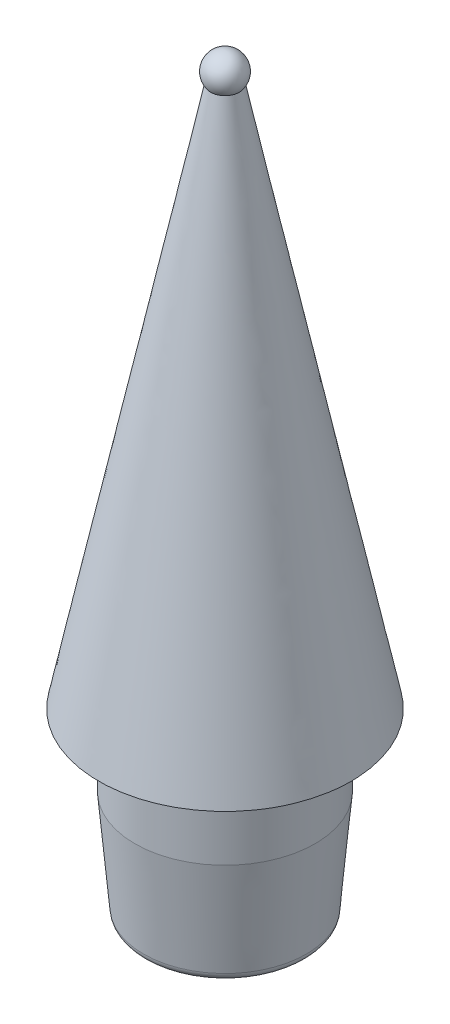
ISO-10303-21;
HEADER;
FILE_DESCRIPTION(('STEP AP214'),'2;1');
FILE_NAME('part.step','',(''),(''),'','','');
FILE_SCHEMA(('AUTOMOTIVE_DESIGN { 1 0 10303 214 1 1 1 1 }'));
ENDSEC;
DATA;
#1=APPLICATION_CONTEXT('core data for automotive mechanical design processes');
#2=APPLICATION_PROTOCOL_DEFINITION('international standard','automotive_design',2000,#1);
#3=PRODUCT_CONTEXT('',#1,'mechanical');
#4=PRODUCT('Part','Part','',(#3));
#5=PRODUCT_RELATED_PRODUCT_CATEGORY('part','',(#4));
#6=PRODUCT_DEFINITION_FORMATION('','',#4);
#7=PRODUCT_DEFINITION_CONTEXT('part definition',#1,'design');
#8=PRODUCT_DEFINITION('design','',#6,#7);
#9=PRODUCT_DEFINITION_SHAPE('','',#8);
#10=(LENGTH_UNIT() NAMED_UNIT(*) SI_UNIT(.MILLI.,.METRE.));
#11=(NAMED_UNIT(*) PLANE_ANGLE_UNIT() SI_UNIT($,.RADIAN.));
#12=(NAMED_UNIT(*) SI_UNIT($,.STERADIAN.) SOLID_ANGLE_UNIT());
#13=UNCERTAINTY_MEASURE_WITH_UNIT(LENGTH_MEASURE(1.E-05),#10,'distance_accuracy_value','');
#14=(GEOMETRIC_REPRESENTATION_CONTEXT(3) GLOBAL_UNCERTAINTY_ASSIGNED_CONTEXT((#13)) GLOBAL_UNIT_ASSIGNED_CONTEXT((#10,
#11,#12)) REPRESENTATION_CONTEXT('',''));
#15=CARTESIAN_POINT('',(0.,0.,0.));
#16=DIRECTION('',(0.,0.,1.));
#17=DIRECTION('',(1.,0.,0.));
#18=AXIS2_PLACEMENT_3D('',#15,#16,#17);
#19=CARTESIAN_POINT('',(0.,5.,0.));
#20=DIRECTION('',(0.,-1.,0.));
#21=DIRECTION('',(0.,0.,-1.));
#22=AXIS2_PLACEMENT_3D('',#19,#20,#21);
#23=CYLINDRICAL_SURFACE('',#22,2.5);
#24=CARTESIAN_POINT('',(0.,4.75,0.));
#25=DIRECTION('',(0.,1.,0.));
#26=DIRECTION('',(0.,0.,1.));
#27=AXIS2_PLACEMENT_3D('',#24,#25,#26);
#28=CIRCLE('',#27,2.5);
#29=CARTESIAN_POINT('',(0.,4.75,2.5));
#30=VERTEX_POINT('',#29);
#31=EDGE_CURVE('E75',#30,#30,#28,.F.);
#32=ORIENTED_EDGE('',*,*,#31,.T.);
#33=EDGE_LOOP('',(#32));
#34=FACE_BOUND('',#33,.T.);
#35=CARTESIAN_POINT('',(0.,3.00000000000018,0.));
#36=DIRECTION('',(0.,1.,0.));
#37=DIRECTION('',(0.,0.,1.));
#38=AXIS2_PLACEMENT_3D('',#35,#36,#37);
#39=CIRCLE('',#38,2.5);
#40=CARTESIAN_POINT('',(0.,3.00000000000018,2.5));
#41=VERTEX_POINT('',#40);
#42=EDGE_CURVE('E83',#41,#41,#39,.T.);
#43=ORIENTED_EDGE('',*,*,#42,.T.);
#44=EDGE_LOOP('',(#43));
#45=FACE_BOUND('',#44,.T.);
#46=ADVANCED_FACE('F42',(#34,#45),#23,.T.);
#47=CARTESIAN_POINT('',(0.,0.,0.));
#48=DIRECTION('',(0.,1.,0.));
#49=DIRECTION('',(0.,0.,1.));
#50=AXIS2_PLACEMENT_3D('',#47,#48,#49);
#51=PLANE('',#50);
#52=CARTESIAN_POINT('',(0.,0.,0.));
#53=DIRECTION('',(0.,1.,0.));
#54=DIRECTION('',(0.,0.,1.));
#55=AXIS2_PLACEMENT_3D('',#52,#53,#54);
#56=CIRCLE('',#55,1.61642219370202);
#57=CARTESIAN_POINT('',(0.,0.,1.61642219370202));
#58=VERTEX_POINT('',#57);
#59=EDGE_CURVE('E68',#58,#58,#56,.T.);
#60=ORIENTED_EDGE('',*,*,#59,.T.);
#61=EDGE_LOOP('',(#60));
#62=FACE_BOUND('',#61,.T.);
#63=CARTESIAN_POINT('',(0.,0.,0.));
#64=DIRECTION('',(0.,1.,0.));
#65=DIRECTION('',(0.,0.,1.));
#66=AXIS2_PLACEMENT_3D('',#63,#64,#65);
#67=CIRCLE('',#66,2.00845121591786);
#68=CARTESIAN_POINT('',(0.,0.,2.00845121591786));
#69=VERTEX_POINT('',#68);
#70=EDGE_CURVE('E72',#69,#69,#67,.F.);
#71=ORIENTED_EDGE('',*,*,#70,.T.);
#72=EDGE_LOOP('',(#71));
#73=FACE_BOUND('',#72,.T.);
#74=ADVANCED_FACE('F131',(#62,#73),#51,.F.);
#75=CARTESIAN_POINT('',(0.,5.,0.));
#76=DIRECTION('',(0.,1.,0.));
#77=DIRECTION('',(0.,0.,1.));
#78=AXIS2_PLACEMENT_3D('',#75,#76,#77);
#79=PLANE('',#78);
#80=CARTESIAN_POINT('',(0.,5.,0.));
#81=DIRECTION('',(0.,1.,0.));
#82=DIRECTION('',(0.,0.,1.));
#83=AXIS2_PLACEMENT_3D('',#80,#81,#82);
#84=CIRCLE('',#83,2.75);
#85=CARTESIAN_POINT('',(0.,5.,2.75));
#86=VERTEX_POINT('',#85);
#87=EDGE_CURVE('E79',#86,#86,#84,.T.);
#88=ORIENTED_EDGE('',*,*,#87,.T.);
#89=EDGE_LOOP('',(#88));
#90=FACE_BOUND('',#89,.T.);
#91=CARTESIAN_POINT('',(0.,5.,0.));
#92=DIRECTION('',(0.,1.,0.));
#93=DIRECTION('',(0.,0.,1.));
#94=AXIS2_PLACEMENT_3D('',#91,#92,#93);
#95=CIRCLE('',#94,3.5);
#96=CARTESIAN_POINT('',(-3.36347141619186,5.,-0.9680186116291));
#97=VERTEX_POINT('',#96);
#98=EDGE_CURVE('E91',#97,#97,#95,.T.);
#99=ORIENTED_EDGE('',*,*,#98,.F.);
#100=EDGE_LOOP('',(#99));
#101=FACE_BOUND('',#100,.T.);
#102=ADVANCED_FACE('F121',(#90,#101),#79,.F.);
#103=CARTESIAN_POINT('',(-0.353623785837754,20.,-0.18694977424371));
#104=CARTESIAN_POINT('',(-3.36347141619186,5.,-0.9680186116291));
#105=CARTESIAN_POINT('',(0.0202757626496648,20.,-0.894197345919219));
#106=CARTESIAN_POINT('',(-1.42743419293366,5.,-7.69496144401282));
#107=CARTESIAN_POINT('',(0.727523334325174,20.,-0.520297797431799));
#108=CARTESIAN_POINT('',(5.29950863945006,5.,-5.75892422075462));
#109=CARTESIAN_POINT('',(0.353623785837755,20.,0.18694977424371));
#110=CARTESIAN_POINT('',(3.36347141619186,5.,0.9680186116291));
#111=CARTESIAN_POINT('',(-0.0202757626496647,20.,0.894197345919219));
#112=CARTESIAN_POINT('',(1.42743419293366,5.,7.69496144401282));
#113=CARTESIAN_POINT('',(-0.727523334325174,20.,0.520297797431799));
#114=CARTESIAN_POINT('',(-5.29950863945006,5.,5.75892422075462));
#115=CARTESIAN_POINT('',(-0.353623785837754,20.,-0.18694977424371));
#116=CARTESIAN_POINT('',(-3.36347141619186,5.,-0.9680186116291));
#117=(BOUNDED_SURFACE() B_SPLINE_SURFACE(3,1,((#103,#104),(#105,#106),(#107,#108),(#109,#110),
(#111,#112),(#113,#114),(#115,#116)),.UNSPECIFIED.,.T.,.F.,.F.) B_SPLINE_SURFACE_WITH_KNOTS((4,
3,4),(2,2),(0.,0.5,1.),(0.,1.),
.UNSPECIFIED.) GEOMETRIC_REPRESENTATION_ITEM() RATIONAL_B_SPLINE_SURFACE(((1.,1.),
(0.333333333333333,0.333333333333333),(0.333333333333333,0.333333333333333),(1.,1.),
(0.333333333333333,0.333333333333333),(0.333333333333333,0.333333333333333),(1.,1.))) REPRESENTATION_ITEM('') SURFACE());
#118=CARTESIAN_POINT('',(0.,20.,0.));
#119=DIRECTION('',(0.,1.,0.));
#120=DIRECTION('',(0.,0.,1.));
#121=AXIS2_PLACEMENT_3D('',#118,#119,#120);
#122=CIRCLE('',#121,0.4);
#123=CARTESIAN_POINT('',(-0.353623785837754,20.,-0.18694977424371));
#124=VERTEX_POINT('',#123);
#125=EDGE_CURVE('E95',#124,#124,#122,.T.);
#126=CARTESIAN_POINT('',(-0.353623785837754,20.,-0.18694977424371));
#127=CARTESIAN_POINT('',(-0.38497636532061,19.84375,-0.195085907966474));
#128=CARTESIAN_POINT('',(-0.416328944803465,19.6875,-0.203222041689239));
#129=CARTESIAN_POINT('',(-0.479034103769175,19.375,-0.219494309134768));
#130=CARTESIAN_POINT('',(-0.510386683252031,19.21875,-0.227630442857532));
#131=CARTESIAN_POINT('',(-0.573091842217741,18.90625,-0.243902710303061));
#132=CARTESIAN_POINT('',(-0.604444421700596,18.75,-0.252038844025825));
#133=CARTESIAN_POINT('',(-0.667149580666307,18.4375,-0.268311111471354));
#134=CARTESIAN_POINT('',(-0.698502160149162,18.28125,-0.276447245194119));
#135=CARTESIAN_POINT('',(-0.761207319114873,17.96875,-0.292719512639648));
#136=CARTESIAN_POINT('',(-0.792559898597728,17.8125,-0.300855646362412));
#137=CARTESIAN_POINT('',(-0.855265057563439,17.5,-0.317127913807941));
#138=CARTESIAN_POINT('',(-0.886617637046294,17.34375,-0.325264047530706));
#139=CARTESIAN_POINT('',(-0.949322796012004,17.03125,-0.341536314976235));
#140=CARTESIAN_POINT('',(-0.98067537549486,16.875,-0.349672448698999));
#141=CARTESIAN_POINT('',(-1.04338053446057,16.5625,-0.365944716144528));
#142=CARTESIAN_POINT('',(-1.07473311394343,16.40625,-0.374080849867293));
#143=CARTESIAN_POINT('',(-1.13743827290914,16.09375,-0.390353117312822));
#144=CARTESIAN_POINT('',(-1.16879085239199,15.9375,-0.398489251035586));
#145=CARTESIAN_POINT('',(-1.2314960113577,15.625,-0.414761518481115));
#146=CARTESIAN_POINT('',(-1.26284859084056,15.46875,-0.42289765220388));
#147=CARTESIAN_POINT('',(-1.32555374980627,15.15625,-0.439169919649409));
#148=CARTESIAN_POINT('',(-1.35690632928912,15.,-0.447306053372173));
#149=CARTESIAN_POINT('',(-1.41961148825483,14.6875,-0.463578320817702));
#150=CARTESIAN_POINT('',(-1.45096406773769,14.53125,-0.471714454540467));
#151=CARTESIAN_POINT('',(-1.5136692267034,14.21875,-0.487986721985996));
#152=CARTESIAN_POINT('',(-1.54502180618625,14.0625,-0.49612285570876));
#153=CARTESIAN_POINT('',(-1.60772696515196,13.75,-0.512395123154289));
#154=CARTESIAN_POINT('',(-1.63907954463482,13.59375,-0.520531256877053));
#155=CARTESIAN_POINT('',(-1.70178470360053,13.28125,-0.536803524322582));
#156=CARTESIAN_POINT('',(-1.73313728308339,13.125,-0.544939658045347));
#157=CARTESIAN_POINT('',(-1.7958424420491,12.8125,-0.561211925490876));
#158=CARTESIAN_POINT('',(-1.82719502153195,12.65625,-0.56934805921364));
#159=CARTESIAN_POINT('',(-1.88990018049766,12.34375,-0.585620326659169));
#160=CARTESIAN_POINT('',(-1.92125275998052,12.1875,-0.593756460381934));
#161=CARTESIAN_POINT('',(-1.98395791894623,11.875,-0.610028727827463));
#162=CARTESIAN_POINT('',(-2.01531049842908,11.71875,-0.618164861550227));
#163=CARTESIAN_POINT('',(-2.07801565739479,11.40625,-0.634437128995756));
#164=CARTESIAN_POINT('',(-2.10936823687765,11.25,-0.642573262718521));
#165=CARTESIAN_POINT('',(-2.17207339584336,10.9375,-0.65884553016405));
#166=CARTESIAN_POINT('',(-2.20342597532621,10.78125,-0.666981663886814));
#167=CARTESIAN_POINT('',(-2.26613113429192,10.46875,-0.683253931332343));
#168=CARTESIAN_POINT('',(-2.29748371377478,10.3125,-0.691390065055108));
#169=CARTESIAN_POINT('',(-2.36018887274049,10.,-0.707662332500637));
#170=CARTESIAN_POINT('',(-2.39154145222335,9.84375,-0.715798466223401));
#171=CARTESIAN_POINT('',(-2.45424661118906,9.53125,-0.73207073366893));
#172=CARTESIAN_POINT('',(-2.48559919067191,9.375,-0.740206867391695));
#173=CARTESIAN_POINT('',(-2.54830434963762,9.0625,-0.756479134837223));
#174=CARTESIAN_POINT('',(-2.57965692912048,8.90625,-0.764615268559988));
#175=CARTESIAN_POINT('',(-2.64236208808619,8.59375,-0.780887536005517));
#176=CARTESIAN_POINT('',(-2.67371466756904,8.4375,-0.789023669728281));
#177=CARTESIAN_POINT('',(-2.73641982653475,8.125,-0.80529593717381));
#178=CARTESIAN_POINT('',(-2.76777240601761,7.96875,-0.813432070896575));
#179=CARTESIAN_POINT('',(-2.83047756498332,7.65625,-0.829704338342104));
#180=CARTESIAN_POINT('',(-2.86183014446617,7.5,-0.837840472064868));
#181=CARTESIAN_POINT('',(-2.92453530343189,7.1875,-0.854112739510397));
#182=CARTESIAN_POINT('',(-2.95588788291474,7.03125,-0.862248873233162));
#183=CARTESIAN_POINT('',(-3.01859304188045,6.71875,-0.878521140678691));
#184=CARTESIAN_POINT('',(-3.04994562136331,6.5625,-0.886657274401455));
#185=CARTESIAN_POINT('',(-3.11265078032902,6.25,-0.902929541846984));
#186=CARTESIAN_POINT('',(-3.14400335981187,6.09375,-0.911065675569749));
#187=CARTESIAN_POINT('',(-3.20670851877758,5.78125,-0.927337943015278));
#188=CARTESIAN_POINT('',(-3.23806109826044,5.625,-0.935474076738042));
#189=CARTESIAN_POINT('',(-3.30076625722615,5.3125,-0.951746344183571));
#190=CARTESIAN_POINT('',(-3.332118836709,5.15625,-0.959882477906336));
#191=CARTESIAN_POINT('',(-3.36347141619186,5.,-0.9680186116291));
#192=B_SPLINE_CURVE_WITH_KNOTS('',3,(#126,#127,#128,#129,#130,#131,#132,#133,#134,#135,#136,
#137,#138,#139,#140,#141,#142,#143,#144,#145,#146,#147,#148,#149,#150,#151,#152,#153,#154,#155,
#156,#157,#158,#159,#160,#161,#162,#163,#164,#165,#166,#167,#168,#169,#170,#171,#172,#173,#174,
#175,#176,#177,#178,#179,#180,#181,#182,#183,#184,#185,#186,#187,#188,#189,#190,#191),
.UNSPECIFIED.,.F.,.F.,(4,2,2,2,2,2,2,2,2,2,2,2,2,2,2,2,2,2,2,2,2,2,2,2,2,2,2,2,2,2,2,2,4),(0.,
0.478716190147828,0.957432380295656,1.43614857044348,1.91486476059131,2.39358095073914,
2.87229714088697,3.35101333103479,3.82972952118262,4.30844571133045,4.78716190147828,
5.2658780916261,5.74459428177393,6.22331047192176,6.70202666206959,7.18074285221741,
7.65945904236524,8.13817523251307,8.6168914226609,9.09560761280873,9.57432380295656,
10.0530399931044,10.5317561832522,11.0104723734,11.4891885635479,11.9679047536957,
12.4466209438435,12.9253371339914,13.4040533241392,13.882769514287,14.3614857044348,
14.8402018945827,15.3189180847305),.UNSPECIFIED.);
#193=EDGE_CURVE('BSEAM108',#124,#97,#192,.T.);
#194=ORIENTED_EDGE('',*,*,#125,.F.);
#195=ORIENTED_EDGE('',*,*,#98,.T.);
#196=ORIENTED_EDGE('',*,*,#193,.T.);
#197=ORIENTED_EDGE('',*,*,#193,.F.);
#198=EDGE_LOOP('',(#194,#196,#195,#197));
#199=FACE_BOUND('',#198,.T.);
#200=ADVANCED_FACE('F108',(#199),#117,.T.);
#201=CARTESIAN_POINT('',(0.,13.,0.));
#202=DIRECTION('',(0.,-1.,0.));
#203=DIRECTION('',(0.,0.,-1.));
#204=AXIS2_PLACEMENT_3D('',#201,#202,#203);
#205=CYLINDRICAL_SURFACE('',#204,1.075);
#206=CARTESIAN_POINT('',(0.,8.59087598488179,0.));
#207=DIRECTION('',(0.,1.,0.));
#208=DIRECTION('',(0.,0.,1.));
#209=AXIS2_PLACEMENT_3D('',#206,#207,#208);
#210=CIRCLE('',#209,1.075);
#211=CARTESIAN_POINT('',(0.,8.59087598488179,-1.075));
#212=VERTEX_POINT('',#211);
#213=EDGE_CURVE('E87',#212,#212,#210,.F.);
#214=CARTESIAN_POINT('',(0.,13.,0.));
#215=DIRECTION('',(0.,1.,0.));
#216=DIRECTION('',(0.,0.,1.));
#217=AXIS2_PLACEMENT_3D('',#214,#215,#216);
#218=CIRCLE('',#217,1.075);
#219=CARTESIAN_POINT('',(0.,13.,-1.075));
#220=VERTEX_POINT('',#219);
#221=EDGE_CURVE('E101',#220,#220,#218,.T.);
#222=CARTESIAN_POINT('',(0.,8.59087598488179,-1.075));
#223=CARTESIAN_POINT('',(0.,8.63680436003927,-1.075));
#224=CARTESIAN_POINT('',(0.,8.68273273519675,-1.075));
#225=CARTESIAN_POINT('',(0.,8.77458948551171,-1.075));
#226=CARTESIAN_POINT('',(0.,8.82051786066919,-1.075));
#227=CARTESIAN_POINT('',(0.,8.91237461098415,-1.075));
#228=CARTESIAN_POINT('',(0.,8.95830298614164,-1.075));
#229=CARTESIAN_POINT('',(0.,9.0501597364566,-1.075));
#230=CARTESIAN_POINT('',(0.,9.09608811161408,-1.075));
#231=CARTESIAN_POINT('',(0.,9.18794486192904,-1.075));
#232=CARTESIAN_POINT('',(0.,9.23387323708652,-1.075));
#233=CARTESIAN_POINT('',(0.,9.32572998740149,-1.075));
#234=CARTESIAN_POINT('',(0.,9.37165836255897,-1.075));
#235=CARTESIAN_POINT('',(0.,9.46351511287393,-1.075));
#236=CARTESIAN_POINT('',(0.,9.50944348803141,-1.075));
#237=CARTESIAN_POINT('',(0.,9.60130023834638,-1.075));
#238=CARTESIAN_POINT('',(0.,9.64722861350386,-1.075));
#239=CARTESIAN_POINT('',(0.,9.73908536381882,-1.075));
#240=CARTESIAN_POINT('',(0.,9.7850137389763,-1.075));
#241=CARTESIAN_POINT('',(0.,9.87687048929126,-1.075));
#242=CARTESIAN_POINT('',(0.,9.92279886444874,-1.075));
#243=CARTESIAN_POINT('',(0.,10.0146556147637,-1.075));
#244=CARTESIAN_POINT('',(0.,10.0605839899212,-1.075));
#245=CARTESIAN_POINT('',(0.,10.1524407402362,-1.075));
#246=CARTESIAN_POINT('',(0.,10.1983691153936,-1.075));
#247=CARTESIAN_POINT('',(0.,10.2902258657086,-1.075));
#248=CARTESIAN_POINT('',(0.,10.3361542408661,-1.075));
#249=CARTESIAN_POINT('',(0.,10.428010991181,-1.075));
#250=CARTESIAN_POINT('',(0.,10.4739393663385,-1.075));
#251=CARTESIAN_POINT('',(0.,10.5657961166535,-1.075));
#252=CARTESIAN_POINT('',(0.,10.611724491811,-1.075));
#253=CARTESIAN_POINT('',(0.,10.7035812421259,-1.075));
#254=CARTESIAN_POINT('',(0.,10.7495096172834,-1.075));
#255=CARTESIAN_POINT('',(0.,10.8413663675984,-1.075));
#256=CARTESIAN_POINT('',(0.,10.8872947427559,-1.075));
#257=CARTESIAN_POINT('',(0.,10.9791514930708,-1.075));
#258=CARTESIAN_POINT('',(0.,11.0250798682283,-1.075));
#259=CARTESIAN_POINT('',(0.,11.1169366185433,-1.075));
#260=CARTESIAN_POINT('',(0.,11.1628649937007,-1.075));
#261=CARTESIAN_POINT('',(0.,11.2547217440157,-1.075));
#262=CARTESIAN_POINT('',(0.,11.3006501191732,-1.075));
#263=CARTESIAN_POINT('',(0.,11.3925068694881,-1.075));
#264=CARTESIAN_POINT('',(0.,11.4384352446456,-1.075));
#265=CARTESIAN_POINT('',(0.,11.5302919949606,-1.075));
#266=CARTESIAN_POINT('',(0.,11.5762203701181,-1.075));
#267=CARTESIAN_POINT('',(0.,11.668077120433,-1.075));
#268=CARTESIAN_POINT('',(0.,11.7140054955905,-1.075));
#269=CARTESIAN_POINT('',(0.,11.8058622459055,-1.075));
#270=CARTESIAN_POINT('',(0.,11.851790621063,-1.075));
#271=CARTESIAN_POINT('',(0.,11.9436473713779,-1.075));
#272=CARTESIAN_POINT('',(0.,11.9895757465354,-1.075));
#273=CARTESIAN_POINT('',(0.,12.0814324968504,-1.075));
#274=CARTESIAN_POINT('',(0.,12.1273608720079,-1.075));
#275=CARTESIAN_POINT('',(0.,12.2192176223228,-1.075));
#276=CARTESIAN_POINT('',(0.,12.2651459974803,-1.075));
#277=CARTESIAN_POINT('',(0.,12.3570027477953,-1.075));
#278=CARTESIAN_POINT('',(0.,12.4029311229527,-1.075));
#279=CARTESIAN_POINT('',(0.,12.4947878732677,-1.075));
#280=CARTESIAN_POINT('',(0.,12.5407162484252,-1.075));
#281=CARTESIAN_POINT('',(0.,12.6325729987401,-1.075));
#282=CARTESIAN_POINT('',(0.,12.6785013738976,-1.075));
#283=CARTESIAN_POINT('',(0.,12.7703581242126,-1.075));
#284=CARTESIAN_POINT('',(0.,12.8162864993701,-1.075));
#285=CARTESIAN_POINT('',(0.,12.908143249685,-1.075));
#286=CARTESIAN_POINT('',(0.,12.9540716248425,-1.075));
#287=CARTESIAN_POINT('',(0.,13.,-1.075));
#288=B_SPLINE_CURVE_WITH_KNOTS('',3,(#222,#223,#224,#225,#226,#227,#228,#229,#230,#231,#232,
#233,#234,#235,#236,#237,#238,#239,#240,#241,#242,#243,#244,#245,#246,#247,#248,#249,#250,#251,
#252,#253,#254,#255,#256,#257,#258,#259,#260,#261,#262,#263,#264,#265,#266,#267,#268,#269,#270,
#271,#272,#273,#274,#275,#276,#277,#278,#279,#280,#281,#282,#283,#284,#285,#286,#287),
.UNSPECIFIED.,.F.,.F.,(4,2,2,2,2,2,2,2,2,2,2,2,2,2,2,2,2,2,2,2,2,2,2,2,2,2,2,2,2,2,2,2,4),(0.,
0.137785125472443,0.275570250944887,0.413355376417332,0.551140501889775,0.688925627362219,
0.826710752834664,0.964495878307109,1.10228100377955,1.240066129252,1.37785125472444,
1.51563638019689,1.65342150566933,1.79120663114177,1.92899175661422,2.06677688208666,
2.20456200755911,2.34234713303155,2.48013225850399,2.61791738397644,2.75570250944888,
2.89348763492133,3.03127276039377,3.16905788586622,3.30684301133866,3.4446281368111,
3.58241326228355,3.72019838775599,3.85798351322844,3.99576863870088,4.13355376417333,
4.27133888964577,4.40912401511821),.UNSPECIFIED.);
#289=EDGE_CURVE('BSEAM120',#212,#220,#288,.T.);
#290=ORIENTED_EDGE('',*,*,#213,.T.);
#291=ORIENTED_EDGE('',*,*,#221,.T.);
#292=ORIENTED_EDGE('',*,*,#289,.T.);
#293=ORIENTED_EDGE('',*,*,#289,.F.);
#294=EDGE_LOOP('',(#290,#292,#291,#293));
#295=FACE_BOUND('',#294,.T.);
#296=ADVANCED_FACE('F120',(#295),#205,.F.);
#297=CARTESIAN_POINT('',(0.,13.,0.));
#298=DIRECTION('',(0.,1.,0.));
#299=DIRECTION('',(0.,0.,1.));
#300=AXIS2_PLACEMENT_3D('',#297,#298,#299);
#301=PLANE('',#300);
#302=CARTESIAN_POINT('',(0.,13.,0.));
#303=DIRECTION('',(0.,1.,0.));
#304=DIRECTION('',(0.,0.,1.));
#305=AXIS2_PLACEMENT_3D('',#302,#303,#304);
#306=CIRCLE('',#305,0.65);
#307=CARTESIAN_POINT('',(0.,13.,0.65));
#308=VERTEX_POINT('',#307);
#309=EDGE_CURVE('E11',#308,#308,#306,.T.);
#310=ORIENTED_EDGE('',*,*,#309,.T.);
#311=EDGE_LOOP('',(#310));
#312=FACE_BOUND('',#311,.T.);
#313=ORIENTED_EDGE('',*,*,#221,.F.);
#314=EDGE_LOOP('',(#313));
#315=FACE_BOUND('',#314,.T.);
#316=ADVANCED_FACE('F143',(#312,#315),#301,.F.);
#317=CARTESIAN_POINT('',(0.,0.,0.));
#318=DIRECTION('',(0.,-1.,0.));
#319=DIRECTION('',(0.,0.,-1.));
#320=AXIS2_PLACEMENT_3D('',#317,#318,#319);
#321=CONICAL_SURFACE('',#320,1.37500000000025,0.0349065850398873);
#322=CARTESIAN_POINT('',(0.,0.241275125824375,0.));
#323=DIRECTION('',(0.,-1.,0.));
#324=DIRECTION('',(0.,0.,-1.));
#325=AXIS2_PLACEMENT_3D('',#322,#323,#324);
#326=CIRCLE('',#325,1.36657448694725);
#327=CARTESIAN_POINT('',(0.,0.241275125824375,-1.36657448694725));
#328=VERTEX_POINT('',#327);
#329=EDGE_CURVE('E63',#328,#328,#326,.T.);
#330=ORIENTED_EDGE('',*,*,#329,.T.);
#331=EDGE_LOOP('',(#330));
#332=FACE_BOUND('',#331,.T.);
#333=ORIENTED_EDGE('',*,*,#213,.F.);
#334=EDGE_LOOP('',(#333));
#335=FACE_BOUND('',#334,.T.);
#336=ADVANCED_FACE('F139',(#332,#335),#321,.F.);
#337=CARTESIAN_POINT('',(0.,3.00000000000018,0.));
#338=DIRECTION('',(0.,1.,0.));
#339=DIRECTION('',(0.,0.,1.));
#340=AXIS2_PLACEMENT_3D('',#337,#338,#339);
#341=CONICAL_SURFACE('',#340,2.5,0.087266462599714);
#342=CARTESIAN_POINT('',(0.,0.228211064313086,0.));
#343=DIRECTION('',(0.,1.,0.));
#344=DIRECTION('',(0.,0.,1.));
#345=AXIS2_PLACEMENT_3D('',#342,#343,#344);
#346=CIRCLE('',#345,2.2574998904408);
#347=CARTESIAN_POINT('',(0.,0.228211064313086,2.2574998904408));
#348=VERTEX_POINT('',#347);
#349=EDGE_CURVE('E57',#348,#348,#346,.T.);
#350=ORIENTED_EDGE('',*,*,#349,.T.);
#351=EDGE_LOOP('',(#350));
#352=FACE_BOUND('',#351,.T.);
#353=ORIENTED_EDGE('',*,*,#42,.F.);
#354=EDGE_LOOP('',(#353));
#355=FACE_BOUND('',#354,.T.);
#356=ADVANCED_FACE('F142',(#352,#355),#341,.T.);
#357=CARTESIAN_POINT('',(0.,4.75,0.));
#358=DIRECTION('',(0.,1.,0.));
#359=DIRECTION('',(0.,0.,1.));
#360=AXIS2_PLACEMENT_3D('',#357,#358,#359);
#361=TOROIDAL_SURFACE('',#360,2.75,0.25);
#362=ORIENTED_EDGE('',*,*,#31,.F.);
#363=EDGE_LOOP('',(#362));
#364=FACE_BOUND('',#363,.T.);
#365=ORIENTED_EDGE('',*,*,#87,.F.);
#366=EDGE_LOOP('',(#365));
#367=FACE_BOUND('',#366,.T.);
#368=ADVANCED_FACE('F147',(#364,#367),#361,.F.);
#369=CARTESIAN_POINT('',(0.,0.25,0.));
#370=DIRECTION('',(0.,1.,0.));
#371=DIRECTION('',(0.,0.,1.));
#372=AXIS2_PLACEMENT_3D('',#369,#370,#371);
#373=TOROIDAL_SURFACE('',#372,1.61642219370202,0.25);
#374=ORIENTED_EDGE('',*,*,#329,.F.);
#375=EDGE_LOOP('',(#374));
#376=FACE_BOUND('',#375,.T.);
#377=ORIENTED_EDGE('',*,*,#59,.F.);
#378=EDGE_LOOP('',(#377));
#379=FACE_BOUND('',#378,.T.);
#380=ADVANCED_FACE('F151',(#376,#379),#373,.T.);
#381=CARTESIAN_POINT('',(0.,0.25,0.));
#382=DIRECTION('',(0.,1.,0.));
#383=DIRECTION('',(0.,0.,1.));
#384=AXIS2_PLACEMENT_3D('',#381,#382,#383);
#385=TOROIDAL_SURFACE('',#384,2.00845121591786,0.25);
#386=ORIENTED_EDGE('',*,*,#349,.F.);
#387=EDGE_LOOP('',(#386));
#388=FACE_BOUND('',#387,.T.);
#389=ORIENTED_EDGE('',*,*,#70,.F.);
#390=EDGE_LOOP('',(#389));
#391=FACE_BOUND('',#390,.T.);
#392=ADVANCED_FACE('F154',(#388,#391),#385,.T.);
#393=CARTESIAN_POINT('',(0.,20.3,0.));
#394=DIRECTION('',(0.,1.,0.));
#395=DIRECTION('',(-1.,0.,0.));
#396=AXIS2_PLACEMENT_3D('',#393,#394,#395);
#397=SPHERICAL_SURFACE('',#396,0.5);
#398=ORIENTED_EDGE('',*,*,#125,.T.);
#399=EDGE_LOOP('',(#398));
#400=FACE_BOUND('',#399,.T.);
#401=ADVANCED_FACE('F157',(#400),#397,.T.);
#402=CARTESIAN_POINT('',(0.,17.,0.));
#403=DIRECTION('',(0.,-1.,0.));
#404=DIRECTION('',(0.,0.,-1.));
#405=AXIS2_PLACEMENT_3D('',#402,#403,#404);
#406=CYLINDRICAL_SURFACE('',#405,0.55);
#407=CARTESIAN_POINT('',(0.,13.1,0.));
#408=DIRECTION('',(0.,1.,0.));
#409=DIRECTION('',(0.,0.,1.));
#410=AXIS2_PLACEMENT_3D('',#407,#408,#409);
#411=CIRCLE('',#410,0.55);
#412=CARTESIAN_POINT('',(0.,13.1,0.55));
#413=VERTEX_POINT('',#412);
#414=EDGE_CURVE('E50',#413,#413,#411,.F.);
#415=ORIENTED_EDGE('',*,*,#414,.T.);
#416=EDGE_LOOP('',(#415));
#417=FACE_BOUND('',#416,.T.);
#418=CARTESIAN_POINT('',(0.,17.,0.));
#419=DIRECTION('',(0.,-1.,0.));
#420=DIRECTION('',(0.,0.,-1.));
#421=AXIS2_PLACEMENT_3D('',#418,#419,#420);
#422=CIRCLE('',#421,0.55);
#423=CARTESIAN_POINT('',(0.,17.,-0.55));
#424=VERTEX_POINT('',#423);
#425=EDGE_CURVE('E191',#424,#424,#422,.T.);
#426=ORIENTED_EDGE('',*,*,#425,.F.);
#427=EDGE_LOOP('',(#426));
#428=FACE_BOUND('',#427,.T.);
#429=ADVANCED_FACE('F162',(#417,#428),#406,.F.);
#430=CARTESIAN_POINT('',(0.,17.,0.));
#431=DIRECTION('',(0.,-1.,0.));
#432=DIRECTION('',(0.,0.,-1.));
#433=AXIS2_PLACEMENT_3D('',#430,#431,#432);
#434=PLANE('',#433);
#435=ORIENTED_EDGE('',*,*,#425,.T.);
#436=EDGE_LOOP('',(#435));
#437=FACE_BOUND('',#436,.T.);
#438=ADVANCED_FACE('F175',(#437),#434,.T.);
#439=CARTESIAN_POINT('',(0.,13.1,0.));
#440=DIRECTION('',(0.,1.,0.));
#441=DIRECTION('',(0.,0.,1.));
#442=AXIS2_PLACEMENT_3D('',#439,#440,#441);
#443=TOROIDAL_SURFACE('',#442,0.65,0.1);
#444=ORIENTED_EDGE('',*,*,#309,.F.);
#445=EDGE_LOOP('',(#444));
#446=FACE_BOUND('',#445,.T.);
#447=ORIENTED_EDGE('',*,*,#414,.F.);
#448=EDGE_LOOP('',(#447));
#449=FACE_BOUND('',#448,.T.);
#450=ADVANCED_FACE('F44',(#446,#449),#443,.T.);
#451=CLOSED_SHELL('',(#46,#74,#102,#200,#296,#316,#336,#356,#368,#380,#392,#401,#429,#438,#450));
#452=MANIFOLD_SOLID_BREP('B2',#451);
#453=ADVANCED_BREP_SHAPE_REPRESENTATION('',(#18,#452),#14);
#454=SHAPE_DEFINITION_REPRESENTATION(#9,#453);
ENDSEC;
END-ISO-10303-21;
